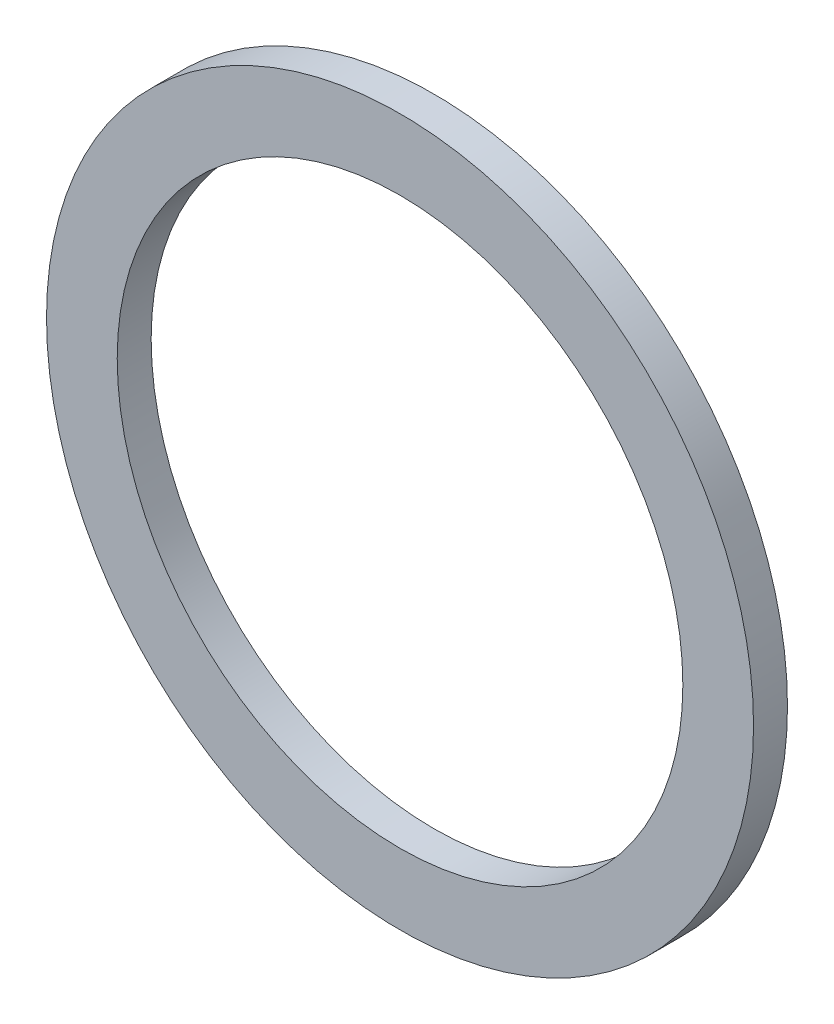
ISO-10303-21;
HEADER;
FILE_DESCRIPTION(('STEP AP214'),'2;1');
FILE_NAME('part.step','',(''),(''),'','','');
FILE_SCHEMA(('AUTOMOTIVE_DESIGN { 1 0 10303 214 1 1 1 1 }'));
ENDSEC;
DATA;
#1=APPLICATION_CONTEXT('core data for automotive mechanical design processes');
#2=APPLICATION_PROTOCOL_DEFINITION('international standard','automotive_design',2000,#1);
#3=PRODUCT_CONTEXT('',#1,'mechanical');
#4=PRODUCT('Part','Part','',(#3));
#5=PRODUCT_RELATED_PRODUCT_CATEGORY('part','',(#4));
#6=PRODUCT_DEFINITION_FORMATION('','',#4);
#7=PRODUCT_DEFINITION_CONTEXT('part definition',#1,'design');
#8=PRODUCT_DEFINITION('design','',#6,#7);
#9=PRODUCT_DEFINITION_SHAPE('','',#8);
#10=(LENGTH_UNIT() NAMED_UNIT(*) SI_UNIT(.MILLI.,.METRE.));
#11=(NAMED_UNIT(*) PLANE_ANGLE_UNIT() SI_UNIT($,.RADIAN.));
#12=(NAMED_UNIT(*) SI_UNIT($,.STERADIAN.) SOLID_ANGLE_UNIT());
#13=UNCERTAINTY_MEASURE_WITH_UNIT(LENGTH_MEASURE(1.E-05),#10,'distance_accuracy_value','');
#14=(GEOMETRIC_REPRESENTATION_CONTEXT(3) GLOBAL_UNCERTAINTY_ASSIGNED_CONTEXT((#13)) GLOBAL_UNIT_ASSIGNED_CONTEXT((#10,
#11,#12)) REPRESENTATION_CONTEXT('',''));
#15=CARTESIAN_POINT('',(0.,0.,0.));
#16=DIRECTION('',(0.,0.,1.));
#17=DIRECTION('',(1.,0.,0.));
#18=AXIS2_PLACEMENT_3D('',#15,#16,#17);
#19=CARTESIAN_POINT('',(0.,0.,1.2));
#20=DIRECTION('',(0.,0.,1.));
#21=DIRECTION('',(1.,0.,0.));
#22=AXIS2_PLACEMENT_3D('',#19,#20,#21);
#23=PLANE('',#22);
#24=CARTESIAN_POINT('',(0.,0.,1.2));
#25=DIRECTION('',(0.,0.,1.));
#26=DIRECTION('',(1.,0.,0.));
#27=AXIS2_PLACEMENT_3D('',#24,#25,#26);
#28=CIRCLE('',#27,12.5);
#29=CARTESIAN_POINT('',(12.5,0.,1.2));
#30=VERTEX_POINT('',#29);
#31=EDGE_CURVE('E10',#30,#30,#28,.T.);
#32=ORIENTED_EDGE('',*,*,#31,.T.);
#33=EDGE_LOOP('',(#32));
#34=FACE_BOUND('',#33,.T.);
#35=CARTESIAN_POINT('',(0.,0.,1.2));
#36=DIRECTION('',(0.,0.,1.));
#37=DIRECTION('',(1.,0.,0.));
#38=AXIS2_PLACEMENT_3D('',#35,#36,#37);
#39=CIRCLE('',#38,10.);
#40=CARTESIAN_POINT('',(10.,0.,1.2));
#41=VERTEX_POINT('',#40);
#42=EDGE_CURVE('E38',#41,#41,#39,.T.);
#43=ORIENTED_EDGE('',*,*,#42,.F.);
#44=EDGE_LOOP('',(#43));
#45=FACE_BOUND('',#44,.T.);
#46=ADVANCED_FACE('F27',(#34,#45),#23,.T.);
#47=CARTESIAN_POINT('',(0.,0.,0.));
#48=DIRECTION('',(0.,0.,1.));
#49=DIRECTION('',(1.,0.,0.));
#50=AXIS2_PLACEMENT_3D('',#47,#48,#49);
#51=PLANE('',#50);
#52=CARTESIAN_POINT('',(0.,0.,0.));
#53=DIRECTION('',(0.,0.,1.));
#54=DIRECTION('',(1.,0.,0.));
#55=AXIS2_PLACEMENT_3D('',#52,#53,#54);
#56=CIRCLE('',#55,12.5);
#57=CARTESIAN_POINT('',(12.5,0.,0.));
#58=VERTEX_POINT('',#57);
#59=EDGE_CURVE('E34',#58,#58,#56,.T.);
#60=ORIENTED_EDGE('',*,*,#59,.F.);
#61=EDGE_LOOP('',(#60));
#62=FACE_BOUND('',#61,.T.);
#63=CARTESIAN_POINT('',(0.,0.,0.));
#64=DIRECTION('',(0.,0.,1.));
#65=DIRECTION('',(1.,0.,0.));
#66=AXIS2_PLACEMENT_3D('',#63,#64,#65);
#67=CIRCLE('',#66,10.);
#68=CARTESIAN_POINT('',(10.,0.,0.));
#69=VERTEX_POINT('',#68);
#70=EDGE_CURVE('E42',#69,#69,#67,.T.);
#71=ORIENTED_EDGE('',*,*,#70,.T.);
#72=EDGE_LOOP('',(#71));
#73=FACE_BOUND('',#72,.T.);
#74=ADVANCED_FACE('F48',(#62,#73),#51,.F.);
#75=CARTESIAN_POINT('',(0.,0.,1.2));
#76=DIRECTION('',(0.,0.,-1.));
#77=DIRECTION('',(-1.,0.,0.));
#78=AXIS2_PLACEMENT_3D('',#75,#76,#77);
#79=CYLINDRICAL_SURFACE('',#78,12.5);
#80=ORIENTED_EDGE('',*,*,#31,.F.);
#81=EDGE_LOOP('',(#80));
#82=FACE_BOUND('',#81,.T.);
#83=ORIENTED_EDGE('',*,*,#59,.T.);
#84=EDGE_LOOP('',(#83));
#85=FACE_BOUND('',#84,.T.);
#86=ADVANCED_FACE('F29',(#82,#85),#79,.T.);
#87=CARTESIAN_POINT('',(0.,0.,1.2));
#88=DIRECTION('',(0.,0.,-1.));
#89=DIRECTION('',(-1.,0.,0.));
#90=AXIS2_PLACEMENT_3D('',#87,#88,#89);
#91=CYLINDRICAL_SURFACE('',#90,10.);
#92=ORIENTED_EDGE('',*,*,#42,.T.);
#93=EDGE_LOOP('',(#92));
#94=FACE_BOUND('',#93,.T.);
#95=ORIENTED_EDGE('',*,*,#70,.F.);
#96=EDGE_LOOP('',(#95));
#97=FACE_BOUND('',#96,.T.);
#98=ADVANCED_FACE('F50',(#94,#97),#91,.F.);
#99=CLOSED_SHELL('',(#46,#74,#86,#98));
#100=MANIFOLD_SOLID_BREP('B2',#99);
#101=ADVANCED_BREP_SHAPE_REPRESENTATION('',(#18,#100),#14);
#102=SHAPE_DEFINITION_REPRESENTATION(#9,#101);
ENDSEC;
END-ISO-10303-21;
